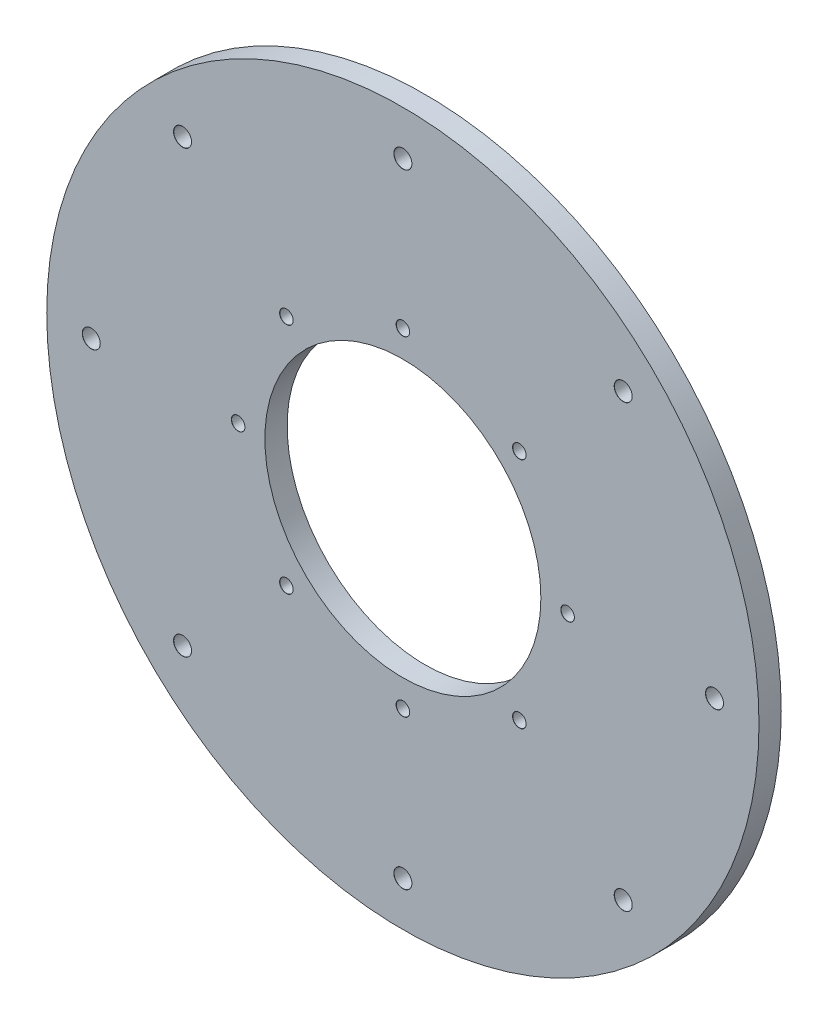
ISO-10303-21;
HEADER;
FILE_DESCRIPTION(('STEP AP214'),'2;1');
FILE_NAME('part.step','',(''),(''),'','','');
FILE_SCHEMA(('AUTOMOTIVE_DESIGN { 1 0 10303 214 1 1 1 1 }'));
ENDSEC;
DATA;
#1=APPLICATION_CONTEXT('core data for automotive mechanical design processes');
#2=APPLICATION_PROTOCOL_DEFINITION('international standard','automotive_design',2000,#1);
#3=PRODUCT_CONTEXT('',#1,'mechanical');
#4=PRODUCT('Part','Part','',(#3));
#5=PRODUCT_RELATED_PRODUCT_CATEGORY('part','',(#4));
#6=PRODUCT_DEFINITION_FORMATION('','',#4);
#7=PRODUCT_DEFINITION_CONTEXT('part definition',#1,'design');
#8=PRODUCT_DEFINITION('design','',#6,#7);
#9=PRODUCT_DEFINITION_SHAPE('','',#8);
#10=(LENGTH_UNIT() NAMED_UNIT(*) SI_UNIT(.MILLI.,.METRE.));
#11=(NAMED_UNIT(*) PLANE_ANGLE_UNIT() SI_UNIT($,.RADIAN.));
#12=(NAMED_UNIT(*) SI_UNIT($,.STERADIAN.) SOLID_ANGLE_UNIT());
#13=UNCERTAINTY_MEASURE_WITH_UNIT(LENGTH_MEASURE(1.E-05),#10,'distance_accuracy_value','');
#14=(GEOMETRIC_REPRESENTATION_CONTEXT(3) GLOBAL_UNCERTAINTY_ASSIGNED_CONTEXT((#13)) GLOBAL_UNIT_ASSIGNED_CONTEXT((#10,
#11,#12)) REPRESENTATION_CONTEXT('',''));
#15=CARTESIAN_POINT('',(0.,0.,0.));
#16=DIRECTION('',(0.,0.,1.));
#17=DIRECTION('',(1.,0.,0.));
#18=AXIS2_PLACEMENT_3D('',#15,#16,#17);
#19=CARTESIAN_POINT('',(0.,0.,0.));
#20=DIRECTION('',(0.,0.,1.));
#21=DIRECTION('',(1.,0.,0.));
#22=AXIS2_PLACEMENT_3D('',#19,#20,#21);
#23=PLANE('',#22);
#24=CARTESIAN_POINT('',(0.,37.,0.));
#25=DIRECTION('',(0.,0.,1.));
#26=DIRECTION('',(1.,0.,0.));
#27=AXIS2_PLACEMENT_3D('',#24,#25,#26);
#28=CIRCLE('',#27,1.5);
#29=CARTESIAN_POINT('',(1.5,37.,0.));
#30=VERTEX_POINT('',#29);
#31=EDGE_CURVE('E238',#30,#30,#28,.F.);
#32=ORIENTED_EDGE('',*,*,#31,.F.);
#33=EDGE_LOOP('',(#32));
#34=FACE_BOUND('',#33,.T.);
#35=CARTESIAN_POINT('',(-36.9999999999969,-3.1641356201817E-12,0.));
#36=DIRECTION('',(0.,0.,1.));
#37=DIRECTION('',(1.,0.,0.));
#38=AXIS2_PLACEMENT_3D('',#35,#36,#37);
#39=CIRCLE('',#38,1.5);
#40=CARTESIAN_POINT('',(-35.4999999999969,-3.1641356201817E-12,0.));
#41=VERTEX_POINT('',#40);
#42=EDGE_CURVE('E214',#41,#41,#39,.F.);
#43=ORIENTED_EDGE('',*,*,#42,.F.);
#44=EDGE_LOOP('',(#43));
#45=FACE_BOUND('',#44,.T.);
#46=CARTESIAN_POINT('',(-26.1629509038969,-26.1629509039045,0.));
#47=DIRECTION('',(0.,0.,1.));
#48=DIRECTION('',(1.,0.,0.));
#49=AXIS2_PLACEMENT_3D('',#46,#47,#48);
#50=CIRCLE('',#49,1.5);
#51=CARTESIAN_POINT('',(-24.6629509038969,-26.1629509039045,0.));
#52=VERTEX_POINT('',#51);
#53=EDGE_CURVE('E202',#52,#52,#50,.F.);
#54=ORIENTED_EDGE('',*,*,#53,.F.);
#55=EDGE_LOOP('',(#54));
#56=FACE_BOUND('',#55,.T.);
#57=CARTESIAN_POINT('',(6.29357677084386E-12,-37.,0.));
#58=DIRECTION('',(0.,0.,1.));
#59=DIRECTION('',(1.,0.,0.));
#60=AXIS2_PLACEMENT_3D('',#57,#58,#59);
#61=CIRCLE('',#60,1.5);
#62=CARTESIAN_POINT('',(1.50000000000629,-37.,0.));
#63=VERTEX_POINT('',#62);
#64=EDGE_CURVE('E190',#63,#63,#61,.F.);
#65=ORIENTED_EDGE('',*,*,#64,.F.);
#66=EDGE_LOOP('',(#65));
#67=FACE_BOUND('',#66,.T.);
#68=CARTESIAN_POINT('',(37.0000000000031,3.15025783237388E-12,0.));
#69=DIRECTION('',(0.,0.,1.));
#70=DIRECTION('',(1.,0.,0.));
#71=AXIS2_PLACEMENT_3D('',#68,#69,#70);
#72=CIRCLE('',#71,1.5);
#73=CARTESIAN_POINT('',(38.5000000000031,3.15025783237388E-12,0.));
#74=VERTEX_POINT('',#73);
#75=EDGE_CURVE('E166',#74,#74,#72,.F.);
#76=ORIENTED_EDGE('',*,*,#75,.F.);
#77=EDGE_LOOP('',(#76));
#78=FACE_BOUND('',#77,.T.);
#79=CARTESIAN_POINT('',(26.1629509039032,26.1629509039045,0.));
#80=DIRECTION('',(0.,0.,1.));
#81=DIRECTION('',(1.,0.,0.));
#82=AXIS2_PLACEMENT_3D('',#79,#80,#81);
#83=CIRCLE('',#82,1.5);
#84=CARTESIAN_POINT('',(27.6629509039032,26.1629509039045,0.));
#85=VERTEX_POINT('',#84);
#86=EDGE_CURVE('E154',#85,#85,#83,.F.);
#87=ORIENTED_EDGE('',*,*,#86,.F.);
#88=EDGE_LOOP('',(#87));
#89=FACE_BOUND('',#88,.T.);
#90=CARTESIAN_POINT('',(0.,70.,0.));
#91=DIRECTION('',(0.,0.,1.));
#92=DIRECTION('',(1.,0.,0.));
#93=AXIS2_PLACEMENT_3D('',#90,#91,#92);
#94=CIRCLE('',#93,1.99999999999999);
#95=CARTESIAN_POINT('',(1.99999999999999,70.,0.));
#96=VERTEX_POINT('',#95);
#97=EDGE_CURVE('E142',#96,#96,#94,.F.);
#98=ORIENTED_EDGE('',*,*,#97,.F.);
#99=EDGE_LOOP('',(#98));
#100=FACE_BOUND('',#99,.T.);
#101=CARTESIAN_POINT('',(-49.4974746830566,49.4974746830541,0.));
#102=DIRECTION('',(0.,0.,1.));
#103=DIRECTION('',(1.,0.,0.));
#104=AXIS2_PLACEMENT_3D('',#101,#102,#103);
#105=CIRCLE('',#104,1.99999999999999);
#106=CARTESIAN_POINT('',(-47.4974746830566,49.4974746830541,0.));
#107=VERTEX_POINT('',#106);
#108=EDGE_CURVE('E130',#107,#107,#105,.F.);
#109=ORIENTED_EDGE('',*,*,#108,.F.);
#110=EDGE_LOOP('',(#109));
#111=FACE_BOUND('',#110,.T.);
#112=CARTESIAN_POINT('',(-49.4974746830482,-49.4974746830625,0.));
#113=DIRECTION('',(0.,0.,1.));
#114=DIRECTION('',(1.,0.,0.));
#115=AXIS2_PLACEMENT_3D('',#112,#113,#114);
#116=CIRCLE('',#115,1.99999999999999);
#117=CARTESIAN_POINT('',(-47.4974746830482,-49.4974746830625,0.));
#118=VERTEX_POINT('',#117);
#119=EDGE_CURVE('E106',#118,#118,#116,.F.);
#120=ORIENTED_EDGE('',*,*,#119,.F.);
#121=EDGE_LOOP('',(#120));
#122=FACE_BOUND('',#121,.T.);
#123=CARTESIAN_POINT('',(1.19175502799607E-11,-70.,0.));
#124=DIRECTION('',(0.,0.,1.));
#125=DIRECTION('',(1.,0.,0.));
#126=AXIS2_PLACEMENT_3D('',#123,#124,#125);
#127=CIRCLE('',#126,1.99999999999999);
#128=CARTESIAN_POINT('',(2.00000000001191,-70.,0.));
#129=VERTEX_POINT('',#128);
#130=EDGE_CURVE('E94',#129,#129,#127,.F.);
#131=ORIENTED_EDGE('',*,*,#130,.F.);
#132=EDGE_LOOP('',(#131));
#133=FACE_BOUND('',#132,.T.);
#134=CARTESIAN_POINT('',(70.000000000006,5.9535709695524E-12,0.));
#135=DIRECTION('',(0.,0.,1.));
#136=DIRECTION('',(1.,0.,0.));
#137=AXIS2_PLACEMENT_3D('',#134,#135,#136);
#138=CIRCLE('',#137,1.99999999999999);
#139=CARTESIAN_POINT('',(72.000000000006,5.9535709695524E-12,0.));
#140=VERTEX_POINT('',#139);
#141=EDGE_CURVE('E70',#140,#140,#138,.F.);
#142=ORIENTED_EDGE('',*,*,#141,.F.);
#143=EDGE_LOOP('',(#142));
#144=FACE_BOUND('',#143,.T.);
#145=CARTESIAN_POINT('',(0.,0.,0.));
#146=DIRECTION('',(0.,0.,1.));
#147=DIRECTION('',(1.,0.,0.));
#148=AXIS2_PLACEMENT_3D('',#145,#146,#147);
#149=CIRCLE('',#148,80.);
#150=CARTESIAN_POINT('',(80.,0.,0.));
#151=VERTEX_POINT('',#150);
#152=EDGE_CURVE('E42',#151,#151,#149,.T.);
#153=ORIENTED_EDGE('',*,*,#152,.F.);
#154=EDGE_LOOP('',(#153));
#155=FACE_BOUND('',#154,.T.);
#156=CARTESIAN_POINT('',(0.,0.,0.));
#157=DIRECTION('',(0.,0.,1.));
#158=DIRECTION('',(1.,0.,0.));
#159=AXIS2_PLACEMENT_3D('',#156,#157,#158);
#160=CIRCLE('',#159,31.);
#161=CARTESIAN_POINT('',(31.,0.,0.));
#162=VERTEX_POINT('',#161);
#163=EDGE_CURVE('E54',#162,#162,#160,.T.);
#164=ORIENTED_EDGE('',*,*,#163,.T.);
#165=EDGE_LOOP('',(#164));
#166=FACE_BOUND('',#165,.T.);
#167=CARTESIAN_POINT('',(49.4974746830601,49.4974746830625,0.));
#168=DIRECTION('',(0.,0.,1.));
#169=DIRECTION('',(1.,0.,0.));
#170=AXIS2_PLACEMENT_3D('',#167,#168,#169);
#171=CIRCLE('',#170,1.99999999999999);
#172=CARTESIAN_POINT('',(51.4974746830601,49.4974746830625,0.));
#173=VERTEX_POINT('',#172);
#174=EDGE_CURVE('E58',#173,#173,#171,.F.);
#175=ORIENTED_EDGE('',*,*,#174,.F.);
#176=EDGE_LOOP('',(#175));
#177=FACE_BOUND('',#176,.T.);
#178=CARTESIAN_POINT('',(49.4974746830685,-49.4974746830541,0.));
#179=DIRECTION('',(0.,0.,1.));
#180=DIRECTION('',(1.,0.,0.));
#181=AXIS2_PLACEMENT_3D('',#178,#179,#180);
#182=CIRCLE('',#181,1.99999999999999);
#183=CARTESIAN_POINT('',(51.4974746830685,-49.4974746830541,0.));
#184=VERTEX_POINT('',#183);
#185=EDGE_CURVE('E82',#184,#184,#182,.F.);
#186=ORIENTED_EDGE('',*,*,#185,.F.);
#187=EDGE_LOOP('',(#186));
#188=FACE_BOUND('',#187,.T.);
#189=CARTESIAN_POINT('',(-69.9999999999941,-5.96744875736022E-12,0.));
#190=DIRECTION('',(0.,0.,1.));
#191=DIRECTION('',(1.,0.,0.));
#192=AXIS2_PLACEMENT_3D('',#189,#190,#191);
#193=CIRCLE('',#192,1.99999999999999);
#194=CARTESIAN_POINT('',(-67.9999999999941,-5.96744875736022E-12,0.));
#195=VERTEX_POINT('',#194);
#196=EDGE_CURVE('E118',#195,#195,#193,.F.);
#197=ORIENTED_EDGE('',*,*,#196,.F.);
#198=EDGE_LOOP('',(#197));
#199=FACE_BOUND('',#198,.T.);
#200=CARTESIAN_POINT('',(26.1629509039076,-26.1629509039,0.));
#201=DIRECTION('',(0.,0.,1.));
#202=DIRECTION('',(1.,0.,0.));
#203=AXIS2_PLACEMENT_3D('',#200,#201,#202);
#204=CIRCLE('',#203,1.5);
#205=CARTESIAN_POINT('',(27.6629509039076,-26.1629509039,0.));
#206=VERTEX_POINT('',#205);
#207=EDGE_CURVE('E178',#206,#206,#204,.F.);
#208=ORIENTED_EDGE('',*,*,#207,.F.);
#209=EDGE_LOOP('',(#208));
#210=FACE_BOUND('',#209,.T.);
#211=CARTESIAN_POINT('',(-26.1629509039013,26.1629509039,0.));
#212=DIRECTION('',(0.,0.,1.));
#213=DIRECTION('',(1.,0.,0.));
#214=AXIS2_PLACEMENT_3D('',#211,#212,#213);
#215=CIRCLE('',#214,1.5);
#216=CARTESIAN_POINT('',(-24.6629509039013,26.1629509039,0.));
#217=VERTEX_POINT('',#216);
#218=EDGE_CURVE('E226',#217,#217,#215,.F.);
#219=ORIENTED_EDGE('',*,*,#218,.F.);
#220=EDGE_LOOP('',(#219));
#221=FACE_BOUND('',#220,.T.);
#222=ADVANCED_FACE('F38',(#34,#45,#56,#67,#78,#89,#100,#111,#122,#133,#144,#155,#166,#177,#188,
#199,#210,#221),#23,.F.);
#223=CARTESIAN_POINT('',(0.,0.,5.));
#224=DIRECTION('',(0.,0.,1.));
#225=DIRECTION('',(1.,0.,0.));
#226=AXIS2_PLACEMENT_3D('',#223,#224,#225);
#227=PLANE('',#226);
#228=CARTESIAN_POINT('',(0.,37.,5.));
#229=DIRECTION('',(0.,0.,1.));
#230=DIRECTION('',(1.,0.,0.));
#231=AXIS2_PLACEMENT_3D('',#228,#229,#230);
#232=CIRCLE('',#231,1.525);
#233=CARTESIAN_POINT('',(1.525,37.,5.));
#234=VERTEX_POINT('',#233);
#235=EDGE_CURVE('E246',#234,#234,#232,.T.);
#236=ORIENTED_EDGE('',*,*,#235,.F.);
#237=EDGE_LOOP('',(#236));
#238=FACE_BOUND('',#237,.T.);
#239=CARTESIAN_POINT('',(-26.1629509039013,26.1629509039,5.));
#240=DIRECTION('',(0.,0.,1.));
#241=DIRECTION('',(1.,0.,0.));
#242=AXIS2_PLACEMENT_3D('',#239,#240,#241);
#243=CIRCLE('',#242,1.525);
#244=CARTESIAN_POINT('',(-24.6379509039013,26.1629509039,5.));
#245=VERTEX_POINT('',#244);
#246=EDGE_CURVE('E234',#245,#245,#243,.T.);
#247=ORIENTED_EDGE('',*,*,#246,.F.);
#248=EDGE_LOOP('',(#247));
#249=FACE_BOUND('',#248,.T.);
#250=CARTESIAN_POINT('',(-36.9999999999969,-3.1641356201817E-12,5.));
#251=DIRECTION('',(0.,0.,1.));
#252=DIRECTION('',(1.,0.,0.));
#253=AXIS2_PLACEMENT_3D('',#250,#251,#252);
#254=CIRCLE('',#253,1.525);
#255=CARTESIAN_POINT('',(-35.4749999999969,-3.1641356201817E-12,5.));
#256=VERTEX_POINT('',#255);
#257=EDGE_CURVE('E222',#256,#256,#254,.T.);
#258=ORIENTED_EDGE('',*,*,#257,.F.);
#259=EDGE_LOOP('',(#258));
#260=FACE_BOUND('',#259,.T.);
#261=CARTESIAN_POINT('',(-26.1629509038969,-26.1629509039045,5.));
#262=DIRECTION('',(0.,0.,1.));
#263=DIRECTION('',(1.,0.,0.));
#264=AXIS2_PLACEMENT_3D('',#261,#262,#263);
#265=CIRCLE('',#264,1.525);
#266=CARTESIAN_POINT('',(-24.6379509038969,-26.1629509039045,5.));
#267=VERTEX_POINT('',#266);
#268=EDGE_CURVE('E210',#267,#267,#265,.T.);
#269=ORIENTED_EDGE('',*,*,#268,.F.);
#270=EDGE_LOOP('',(#269));
#271=FACE_BOUND('',#270,.T.);
#272=CARTESIAN_POINT('',(6.29357677084386E-12,-37.,5.));
#273=DIRECTION('',(0.,0.,1.));
#274=DIRECTION('',(1.,0.,0.));
#275=AXIS2_PLACEMENT_3D('',#272,#273,#274);
#276=CIRCLE('',#275,1.525);
#277=CARTESIAN_POINT('',(1.52500000000629,-37.,5.));
#278=VERTEX_POINT('',#277);
#279=EDGE_CURVE('E198',#278,#278,#276,.T.);
#280=ORIENTED_EDGE('',*,*,#279,.F.);
#281=EDGE_LOOP('',(#280));
#282=FACE_BOUND('',#281,.T.);
#283=CARTESIAN_POINT('',(26.1629509039076,-26.1629509039,5.));
#284=DIRECTION('',(0.,0.,1.));
#285=DIRECTION('',(1.,0.,0.));
#286=AXIS2_PLACEMENT_3D('',#283,#284,#285);
#287=CIRCLE('',#286,1.525);
#288=CARTESIAN_POINT('',(27.6879509039076,-26.1629509039,5.));
#289=VERTEX_POINT('',#288);
#290=EDGE_CURVE('E186',#289,#289,#287,.T.);
#291=ORIENTED_EDGE('',*,*,#290,.F.);
#292=EDGE_LOOP('',(#291));
#293=FACE_BOUND('',#292,.T.);
#294=CARTESIAN_POINT('',(37.0000000000031,3.15025783237388E-12,5.));
#295=DIRECTION('',(0.,0.,1.));
#296=DIRECTION('',(1.,0.,0.));
#297=AXIS2_PLACEMENT_3D('',#294,#295,#296);
#298=CIRCLE('',#297,1.525);
#299=CARTESIAN_POINT('',(38.5250000000031,3.15025783237388E-12,5.));
#300=VERTEX_POINT('',#299);
#301=EDGE_CURVE('E174',#300,#300,#298,.T.);
#302=ORIENTED_EDGE('',*,*,#301,.F.);
#303=EDGE_LOOP('',(#302));
#304=FACE_BOUND('',#303,.T.);
#305=CARTESIAN_POINT('',(26.1629509039032,26.1629509039045,5.));
#306=DIRECTION('',(0.,0.,1.));
#307=DIRECTION('',(1.,0.,0.));
#308=AXIS2_PLACEMENT_3D('',#305,#306,#307);
#309=CIRCLE('',#308,1.525);
#310=CARTESIAN_POINT('',(27.6879509039032,26.1629509039045,5.));
#311=VERTEX_POINT('',#310);
#312=EDGE_CURVE('E162',#311,#311,#309,.T.);
#313=ORIENTED_EDGE('',*,*,#312,.F.);
#314=EDGE_LOOP('',(#313));
#315=FACE_BOUND('',#314,.T.);
#316=CARTESIAN_POINT('',(0.,70.,5.));
#317=DIRECTION('',(0.,0.,1.));
#318=DIRECTION('',(1.,0.,0.));
#319=AXIS2_PLACEMENT_3D('',#316,#317,#318);
#320=CIRCLE('',#319,2.025);
#321=CARTESIAN_POINT('',(2.025,70.,5.));
#322=VERTEX_POINT('',#321);
#323=EDGE_CURVE('E150',#322,#322,#320,.T.);
#324=ORIENTED_EDGE('',*,*,#323,.F.);
#325=EDGE_LOOP('',(#324));
#326=FACE_BOUND('',#325,.T.);
#327=CARTESIAN_POINT('',(-49.4974746830566,49.4974746830541,5.));
#328=DIRECTION('',(0.,0.,1.));
#329=DIRECTION('',(1.,0.,0.));
#330=AXIS2_PLACEMENT_3D('',#327,#328,#329);
#331=CIRCLE('',#330,2.025);
#332=CARTESIAN_POINT('',(-47.4724746830566,49.4974746830541,5.));
#333=VERTEX_POINT('',#332);
#334=EDGE_CURVE('E138',#333,#333,#331,.T.);
#335=ORIENTED_EDGE('',*,*,#334,.F.);
#336=EDGE_LOOP('',(#335));
#337=FACE_BOUND('',#336,.T.);
#338=CARTESIAN_POINT('',(-69.9999999999941,-5.96744875736022E-12,5.));
#339=DIRECTION('',(0.,0.,1.));
#340=DIRECTION('',(1.,0.,0.));
#341=AXIS2_PLACEMENT_3D('',#338,#339,#340);
#342=CIRCLE('',#341,2.025);
#343=CARTESIAN_POINT('',(-67.9749999999941,-5.96744875736022E-12,5.));
#344=VERTEX_POINT('',#343);
#345=EDGE_CURVE('E126',#344,#344,#342,.T.);
#346=ORIENTED_EDGE('',*,*,#345,.F.);
#347=EDGE_LOOP('',(#346));
#348=FACE_BOUND('',#347,.T.);
#349=CARTESIAN_POINT('',(-49.4974746830482,-49.4974746830625,5.));
#350=DIRECTION('',(0.,0.,1.));
#351=DIRECTION('',(1.,0.,0.));
#352=AXIS2_PLACEMENT_3D('',#349,#350,#351);
#353=CIRCLE('',#352,2.025);
#354=CARTESIAN_POINT('',(-47.4724746830482,-49.4974746830625,5.));
#355=VERTEX_POINT('',#354);
#356=EDGE_CURVE('E114',#355,#355,#353,.T.);
#357=ORIENTED_EDGE('',*,*,#356,.F.);
#358=EDGE_LOOP('',(#357));
#359=FACE_BOUND('',#358,.T.);
#360=CARTESIAN_POINT('',(1.19175502799607E-11,-70.,5.));
#361=DIRECTION('',(0.,0.,1.));
#362=DIRECTION('',(1.,0.,0.));
#363=AXIS2_PLACEMENT_3D('',#360,#361,#362);
#364=CIRCLE('',#363,2.025);
#365=CARTESIAN_POINT('',(2.02500000001192,-70.,5.));
#366=VERTEX_POINT('',#365);
#367=EDGE_CURVE('E102',#366,#366,#364,.T.);
#368=ORIENTED_EDGE('',*,*,#367,.F.);
#369=EDGE_LOOP('',(#368));
#370=FACE_BOUND('',#369,.T.);
#371=CARTESIAN_POINT('',(49.4974746830685,-49.4974746830541,5.));
#372=DIRECTION('',(0.,0.,1.));
#373=DIRECTION('',(1.,0.,0.));
#374=AXIS2_PLACEMENT_3D('',#371,#372,#373);
#375=CIRCLE('',#374,2.025);
#376=CARTESIAN_POINT('',(51.5224746830685,-49.4974746830541,5.));
#377=VERTEX_POINT('',#376);
#378=EDGE_CURVE('E90',#377,#377,#375,.T.);
#379=ORIENTED_EDGE('',*,*,#378,.F.);
#380=EDGE_LOOP('',(#379));
#381=FACE_BOUND('',#380,.T.);
#382=CARTESIAN_POINT('',(70.000000000006,5.9535709695524E-12,5.));
#383=DIRECTION('',(0.,0.,1.));
#384=DIRECTION('',(1.,0.,0.));
#385=AXIS2_PLACEMENT_3D('',#382,#383,#384);
#386=CIRCLE('',#385,2.025);
#387=CARTESIAN_POINT('',(72.025000000006,5.9535709695524E-12,5.));
#388=VERTEX_POINT('',#387);
#389=EDGE_CURVE('E78',#388,#388,#386,.T.);
#390=ORIENTED_EDGE('',*,*,#389,.F.);
#391=EDGE_LOOP('',(#390));
#392=FACE_BOUND('',#391,.T.);
#393=CARTESIAN_POINT('',(49.4974746830601,49.4974746830625,5.));
#394=DIRECTION('',(0.,0.,1.));
#395=DIRECTION('',(1.,0.,0.));
#396=AXIS2_PLACEMENT_3D('',#393,#394,#395);
#397=CIRCLE('',#396,2.025);
#398=CARTESIAN_POINT('',(51.5224746830601,49.4974746830625,5.));
#399=VERTEX_POINT('',#398);
#400=EDGE_CURVE('E66',#399,#399,#397,.T.);
#401=ORIENTED_EDGE('',*,*,#400,.F.);
#402=EDGE_LOOP('',(#401));
#403=FACE_BOUND('',#402,.T.);
#404=CARTESIAN_POINT('',(0.,0.,5.));
#405=DIRECTION('',(0.,0.,1.));
#406=DIRECTION('',(1.,0.,0.));
#407=AXIS2_PLACEMENT_3D('',#404,#405,#406);
#408=CIRCLE('',#407,80.);
#409=CARTESIAN_POINT('',(80.,0.,5.));
#410=VERTEX_POINT('',#409);
#411=EDGE_CURVE('E10',#410,#410,#408,.T.);
#412=ORIENTED_EDGE('',*,*,#411,.T.);
#413=EDGE_LOOP('',(#412));
#414=FACE_BOUND('',#413,.T.);
#415=CARTESIAN_POINT('',(0.,0.,5.));
#416=DIRECTION('',(0.,0.,1.));
#417=DIRECTION('',(1.,0.,0.));
#418=AXIS2_PLACEMENT_3D('',#415,#416,#417);
#419=CIRCLE('',#418,31.);
#420=CARTESIAN_POINT('',(31.,0.,5.));
#421=VERTEX_POINT('',#420);
#422=EDGE_CURVE('E52',#421,#421,#419,.T.);
#423=ORIENTED_EDGE('',*,*,#422,.F.);
#424=EDGE_LOOP('',(#423));
#425=FACE_BOUND('',#424,.T.);
#426=ADVANCED_FACE('F260',(#238,#249,#260,#271,#282,#293,#304,#315,#326,#337,#348,#359,#370,
#381,#392,#403,#414,#425),#227,.T.);
#427=CARTESIAN_POINT('',(0.,0.,5.));
#428=DIRECTION('',(0.,0.,-1.));
#429=DIRECTION('',(-1.,0.,0.));
#430=AXIS2_PLACEMENT_3D('',#427,#428,#429);
#431=CYLINDRICAL_SURFACE('',#430,80.);
#432=ORIENTED_EDGE('',*,*,#411,.F.);
#433=EDGE_LOOP('',(#432));
#434=FACE_BOUND('',#433,.T.);
#435=ORIENTED_EDGE('',*,*,#152,.T.);
#436=EDGE_LOOP('',(#435));
#437=FACE_BOUND('',#436,.T.);
#438=ADVANCED_FACE('F40',(#434,#437),#431,.T.);
#439=CARTESIAN_POINT('',(0.,0.,5.));
#440=DIRECTION('',(0.,0.,-1.));
#441=DIRECTION('',(-1.,0.,0.));
#442=AXIS2_PLACEMENT_3D('',#439,#440,#441);
#443=CYLINDRICAL_SURFACE('',#442,31.);
#444=ORIENTED_EDGE('',*,*,#422,.T.);
#445=EDGE_LOOP('',(#444));
#446=FACE_BOUND('',#445,.T.);
#447=ORIENTED_EDGE('',*,*,#163,.F.);
#448=EDGE_LOOP('',(#447));
#449=FACE_BOUND('',#448,.T.);
#450=ADVANCED_FACE('F342',(#446,#449),#443,.F.);
#451=CARTESIAN_POINT('',(49.4974746830601,49.4974746830625,5.));
#452=DIRECTION('',(0.,0.,1.));
#453=DIRECTION('',(1.,0.,0.));
#454=AXIS2_PLACEMENT_3D('',#451,#452,#453);
#455=CYLINDRICAL_SURFACE('',#454,1.99999999999999);
#456=ORIENTED_EDGE('',*,*,#174,.T.);
#457=EDGE_LOOP('',(#456));
#458=FACE_BOUND('',#457,.T.);
#459=CARTESIAN_POINT('',(49.4974746830601,49.4974746830625,4.97499999999998));
#460=DIRECTION('',(0.,0.,1.));
#461=DIRECTION('',(1.,0.,0.));
#462=AXIS2_PLACEMENT_3D('',#459,#460,#461);
#463=CIRCLE('',#462,1.99999999999999);
#464=CARTESIAN_POINT('',(51.4974746830601,49.4974746830625,4.97499999999998));
#465=VERTEX_POINT('',#464);
#466=EDGE_CURVE('E62',#465,#465,#463,.T.);
#467=ORIENTED_EDGE('',*,*,#466,.T.);
#468=EDGE_LOOP('',(#467));
#469=FACE_BOUND('',#468,.T.);
#470=ADVANCED_FACE('F345',(#458,#469),#455,.F.);
#471=CARTESIAN_POINT('',(49.4974746830601,49.4974746830625,5.));
#472=DIRECTION('',(0.,0.,1.));
#473=DIRECTION('',(1.,0.,0.));
#474=AXIS2_PLACEMENT_3D('',#471,#472,#473);
#475=CONICAL_SURFACE('',#474,2.025,0.785398163397414);
#476=ORIENTED_EDGE('',*,*,#466,.F.);
#477=EDGE_LOOP('',(#476));
#478=FACE_BOUND('',#477,.T.);
#479=ORIENTED_EDGE('',*,*,#400,.T.);
#480=EDGE_LOOP('',(#479));
#481=FACE_BOUND('',#480,.T.);
#482=ADVANCED_FACE('F351',(#478,#481),#475,.F.);
#483=CARTESIAN_POINT('',(70.000000000006,5.9535709695524E-12,5.));
#484=DIRECTION('',(0.,0.,1.));
#485=DIRECTION('',(1.,0.,0.));
#486=AXIS2_PLACEMENT_3D('',#483,#484,#485);
#487=CYLINDRICAL_SURFACE('',#486,1.99999999999999);
#488=ORIENTED_EDGE('',*,*,#141,.T.);
#489=EDGE_LOOP('',(#488));
#490=FACE_BOUND('',#489,.T.);
#491=CARTESIAN_POINT('',(70.000000000006,5.9535709695524E-12,4.97499999999998));
#492=DIRECTION('',(0.,0.,1.));
#493=DIRECTION('',(1.,0.,0.));
#494=AXIS2_PLACEMENT_3D('',#491,#492,#493);
#495=CIRCLE('',#494,1.99999999999999);
#496=CARTESIAN_POINT('',(72.000000000006,5.9535709695524E-12,4.97499999999998));
#497=VERTEX_POINT('',#496);
#498=EDGE_CURVE('E74',#497,#497,#495,.T.);
#499=ORIENTED_EDGE('',*,*,#498,.T.);
#500=EDGE_LOOP('',(#499));
#501=FACE_BOUND('',#500,.T.);
#502=ADVANCED_FACE('F358',(#490,#501),#487,.F.);
#503=CARTESIAN_POINT('',(70.000000000006,5.9535709695524E-12,5.));
#504=DIRECTION('',(0.,0.,1.));
#505=DIRECTION('',(1.,0.,0.));
#506=AXIS2_PLACEMENT_3D('',#503,#504,#505);
#507=CONICAL_SURFACE('',#506,2.025,0.785398163397414);
#508=ORIENTED_EDGE('',*,*,#498,.F.);
#509=EDGE_LOOP('',(#508));
#510=FACE_BOUND('',#509,.T.);
#511=ORIENTED_EDGE('',*,*,#389,.T.);
#512=EDGE_LOOP('',(#511));
#513=FACE_BOUND('',#512,.T.);
#514=ADVANCED_FACE('F362',(#510,#513),#507,.F.);
#515=CARTESIAN_POINT('',(49.4974746830685,-49.4974746830541,5.));
#516=DIRECTION('',(0.,0.,1.));
#517=DIRECTION('',(1.,0.,0.));
#518=AXIS2_PLACEMENT_3D('',#515,#516,#517);
#519=CYLINDRICAL_SURFACE('',#518,1.99999999999999);
#520=ORIENTED_EDGE('',*,*,#185,.T.);
#521=EDGE_LOOP('',(#520));
#522=FACE_BOUND('',#521,.T.);
#523=CARTESIAN_POINT('',(49.4974746830685,-49.4974746830541,4.97499999999998));
#524=DIRECTION('',(0.,0.,1.));
#525=DIRECTION('',(1.,0.,0.));
#526=AXIS2_PLACEMENT_3D('',#523,#524,#525);
#527=CIRCLE('',#526,1.99999999999999);
#528=CARTESIAN_POINT('',(51.4974746830685,-49.4974746830541,4.97499999999998));
#529=VERTEX_POINT('',#528);
#530=EDGE_CURVE('E86',#529,#529,#527,.T.);
#531=ORIENTED_EDGE('',*,*,#530,.T.);
#532=EDGE_LOOP('',(#531));
#533=FACE_BOUND('',#532,.T.);
#534=ADVANCED_FACE('F366',(#522,#533),#519,.F.);
#535=CARTESIAN_POINT('',(49.4974746830685,-49.4974746830541,5.));
#536=DIRECTION('',(0.,0.,1.));
#537=DIRECTION('',(1.,0.,0.));
#538=AXIS2_PLACEMENT_3D('',#535,#536,#537);
#539=CONICAL_SURFACE('',#538,2.025,0.785398163397414);
#540=ORIENTED_EDGE('',*,*,#530,.F.);
#541=EDGE_LOOP('',(#540));
#542=FACE_BOUND('',#541,.T.);
#543=ORIENTED_EDGE('',*,*,#378,.T.);
#544=EDGE_LOOP('',(#543));
#545=FACE_BOUND('',#544,.T.);
#546=ADVANCED_FACE('F370',(#542,#545),#539,.F.);
#547=CARTESIAN_POINT('',(1.19175502799607E-11,-70.,5.));
#548=DIRECTION('',(0.,0.,1.));
#549=DIRECTION('',(1.,0.,0.));
#550=AXIS2_PLACEMENT_3D('',#547,#548,#549);
#551=CYLINDRICAL_SURFACE('',#550,1.99999999999999);
#552=ORIENTED_EDGE('',*,*,#130,.T.);
#553=EDGE_LOOP('',(#552));
#554=FACE_BOUND('',#553,.T.);
#555=CARTESIAN_POINT('',(1.19175502799607E-11,-70.,4.97499999999998));
#556=DIRECTION('',(0.,0.,1.));
#557=DIRECTION('',(1.,0.,0.));
#558=AXIS2_PLACEMENT_3D('',#555,#556,#557);
#559=CIRCLE('',#558,1.99999999999999);
#560=CARTESIAN_POINT('',(2.00000000001191,-70.,4.97499999999998));
#561=VERTEX_POINT('',#560);
#562=EDGE_CURVE('E98',#561,#561,#559,.T.);
#563=ORIENTED_EDGE('',*,*,#562,.T.);
#564=EDGE_LOOP('',(#563));
#565=FACE_BOUND('',#564,.T.);
#566=ADVANCED_FACE('F374',(#554,#565),#551,.F.);
#567=CARTESIAN_POINT('',(1.19175502799607E-11,-70.,5.));
#568=DIRECTION('',(0.,0.,1.));
#569=DIRECTION('',(1.,0.,0.));
#570=AXIS2_PLACEMENT_3D('',#567,#568,#569);
#571=CONICAL_SURFACE('',#570,2.025,0.785398163397379);
#572=ORIENTED_EDGE('',*,*,#562,.F.);
#573=EDGE_LOOP('',(#572));
#574=FACE_BOUND('',#573,.T.);
#575=ORIENTED_EDGE('',*,*,#367,.T.);
#576=EDGE_LOOP('',(#575));
#577=FACE_BOUND('',#576,.T.);
#578=ADVANCED_FACE('F378',(#574,#577),#571,.F.);
#579=CARTESIAN_POINT('',(-49.4974746830482,-49.4974746830625,5.));
#580=DIRECTION('',(0.,0.,1.));
#581=DIRECTION('',(1.,0.,0.));
#582=AXIS2_PLACEMENT_3D('',#579,#580,#581);
#583=CYLINDRICAL_SURFACE('',#582,1.99999999999999);
#584=ORIENTED_EDGE('',*,*,#119,.T.);
#585=EDGE_LOOP('',(#584));
#586=FACE_BOUND('',#585,.T.);
#587=CARTESIAN_POINT('',(-49.4974746830482,-49.4974746830625,4.97499999999998));
#588=DIRECTION('',(0.,0.,1.));
#589=DIRECTION('',(1.,0.,0.));
#590=AXIS2_PLACEMENT_3D('',#587,#588,#589);
#591=CIRCLE('',#590,1.99999999999999);
#592=CARTESIAN_POINT('',(-47.4974746830482,-49.4974746830625,4.97499999999998));
#593=VERTEX_POINT('',#592);
#594=EDGE_CURVE('E110',#593,#593,#591,.T.);
#595=ORIENTED_EDGE('',*,*,#594,.T.);
#596=EDGE_LOOP('',(#595));
#597=FACE_BOUND('',#596,.T.);
#598=ADVANCED_FACE('F382',(#586,#597),#583,.F.);
#599=CARTESIAN_POINT('',(-49.4974746830482,-49.4974746830625,5.));
#600=DIRECTION('',(0.,0.,1.));
#601=DIRECTION('',(1.,0.,0.));
#602=AXIS2_PLACEMENT_3D('',#599,#600,#601);
#603=CONICAL_SURFACE('',#602,2.025,0.785398163397414);
#604=ORIENTED_EDGE('',*,*,#594,.F.);
#605=EDGE_LOOP('',(#604));
#606=FACE_BOUND('',#605,.T.);
#607=ORIENTED_EDGE('',*,*,#356,.T.);
#608=EDGE_LOOP('',(#607));
#609=FACE_BOUND('',#608,.T.);
#610=ADVANCED_FACE('F386',(#606,#609),#603,.F.);
#611=CARTESIAN_POINT('',(-69.9999999999941,-5.96744875736022E-12,5.));
#612=DIRECTION('',(0.,0.,1.));
#613=DIRECTION('',(1.,0.,0.));
#614=AXIS2_PLACEMENT_3D('',#611,#612,#613);
#615=CYLINDRICAL_SURFACE('',#614,1.99999999999999);
#616=ORIENTED_EDGE('',*,*,#196,.T.);
#617=EDGE_LOOP('',(#616));
#618=FACE_BOUND('',#617,.T.);
#619=CARTESIAN_POINT('',(-69.9999999999941,-5.96744875736022E-12,4.97499999999998));
#620=DIRECTION('',(0.,0.,1.));
#621=DIRECTION('',(1.,0.,0.));
#622=AXIS2_PLACEMENT_3D('',#619,#620,#621);
#623=CIRCLE('',#622,1.99999999999999);
#624=CARTESIAN_POINT('',(-67.9999999999941,-5.96744875736022E-12,4.97499999999998));
#625=VERTEX_POINT('',#624);
#626=EDGE_CURVE('E122',#625,#625,#623,.T.);
#627=ORIENTED_EDGE('',*,*,#626,.T.);
#628=EDGE_LOOP('',(#627));
#629=FACE_BOUND('',#628,.T.);
#630=ADVANCED_FACE('F390',(#618,#629),#615,.F.);
#631=CARTESIAN_POINT('',(-69.9999999999941,-5.96744875736022E-12,5.));
#632=DIRECTION('',(0.,0.,1.));
#633=DIRECTION('',(1.,0.,0.));
#634=AXIS2_PLACEMENT_3D('',#631,#632,#633);
#635=CONICAL_SURFACE('',#634,2.025,0.785398163397414);
#636=ORIENTED_EDGE('',*,*,#626,.F.);
#637=EDGE_LOOP('',(#636));
#638=FACE_BOUND('',#637,.T.);
#639=ORIENTED_EDGE('',*,*,#345,.T.);
#640=EDGE_LOOP('',(#639));
#641=FACE_BOUND('',#640,.T.);
#642=ADVANCED_FACE('F394',(#638,#641),#635,.F.);
#643=CARTESIAN_POINT('',(-49.4974746830566,49.4974746830541,5.));
#644=DIRECTION('',(0.,0.,1.));
#645=DIRECTION('',(1.,0.,0.));
#646=AXIS2_PLACEMENT_3D('',#643,#644,#645);
#647=CYLINDRICAL_SURFACE('',#646,1.99999999999999);
#648=ORIENTED_EDGE('',*,*,#108,.T.);
#649=EDGE_LOOP('',(#648));
#650=FACE_BOUND('',#649,.T.);
#651=CARTESIAN_POINT('',(-49.4974746830566,49.4974746830541,4.97499999999998));
#652=DIRECTION('',(0.,0.,1.));
#653=DIRECTION('',(1.,0.,0.));
#654=AXIS2_PLACEMENT_3D('',#651,#652,#653);
#655=CIRCLE('',#654,1.99999999999999);
#656=CARTESIAN_POINT('',(-47.4974746830566,49.4974746830541,4.97499999999998));
#657=VERTEX_POINT('',#656);
#658=EDGE_CURVE('E134',#657,#657,#655,.T.);
#659=ORIENTED_EDGE('',*,*,#658,.T.);
#660=EDGE_LOOP('',(#659));
#661=FACE_BOUND('',#660,.T.);
#662=ADVANCED_FACE('F398',(#650,#661),#647,.F.);
#663=CARTESIAN_POINT('',(-49.4974746830566,49.4974746830541,5.));
#664=DIRECTION('',(0.,0.,1.));
#665=DIRECTION('',(1.,0.,0.));
#666=AXIS2_PLACEMENT_3D('',#663,#664,#665);
#667=CONICAL_SURFACE('',#666,2.025,0.785398163397414);
#668=ORIENTED_EDGE('',*,*,#658,.F.);
#669=EDGE_LOOP('',(#668));
#670=FACE_BOUND('',#669,.T.);
#671=ORIENTED_EDGE('',*,*,#334,.T.);
#672=EDGE_LOOP('',(#671));
#673=FACE_BOUND('',#672,.T.);
#674=ADVANCED_FACE('F402',(#670,#673),#667,.F.);
#675=CARTESIAN_POINT('',(0.,70.,5.));
#676=DIRECTION('',(0.,0.,1.));
#677=DIRECTION('',(1.,0.,0.));
#678=AXIS2_PLACEMENT_3D('',#675,#676,#677);
#679=CYLINDRICAL_SURFACE('',#678,1.99999999999999);
#680=ORIENTED_EDGE('',*,*,#97,.T.);
#681=EDGE_LOOP('',(#680));
#682=FACE_BOUND('',#681,.T.);
#683=CARTESIAN_POINT('',(0.,70.,4.97499999999998));
#684=DIRECTION('',(0.,0.,1.));
#685=DIRECTION('',(1.,0.,0.));
#686=AXIS2_PLACEMENT_3D('',#683,#684,#685);
#687=CIRCLE('',#686,1.99999999999999);
#688=CARTESIAN_POINT('',(1.99999999999999,70.,4.97499999999998));
#689=VERTEX_POINT('',#688);
#690=EDGE_CURVE('E146',#689,#689,#687,.T.);
#691=ORIENTED_EDGE('',*,*,#690,.T.);
#692=EDGE_LOOP('',(#691));
#693=FACE_BOUND('',#692,.T.);
#694=ADVANCED_FACE('F406',(#682,#693),#679,.F.);
#695=CARTESIAN_POINT('',(0.,70.,5.));
#696=DIRECTION('',(0.,0.,1.));
#697=DIRECTION('',(1.,0.,0.));
#698=AXIS2_PLACEMENT_3D('',#695,#696,#697);
#699=CONICAL_SURFACE('',#698,2.025,0.785398163397379);
#700=ORIENTED_EDGE('',*,*,#690,.F.);
#701=EDGE_LOOP('',(#700));
#702=FACE_BOUND('',#701,.T.);
#703=ORIENTED_EDGE('',*,*,#323,.T.);
#704=EDGE_LOOP('',(#703));
#705=FACE_BOUND('',#704,.T.);
#706=ADVANCED_FACE('F410',(#702,#705),#699,.F.);
#707=CARTESIAN_POINT('',(26.1629509039032,26.1629509039045,5.));
#708=DIRECTION('',(0.,0.,1.));
#709=DIRECTION('',(1.,0.,0.));
#710=AXIS2_PLACEMENT_3D('',#707,#708,#709);
#711=CYLINDRICAL_SURFACE('',#710,1.5);
#712=ORIENTED_EDGE('',*,*,#86,.T.);
#713=EDGE_LOOP('',(#712));
#714=FACE_BOUND('',#713,.T.);
#715=CARTESIAN_POINT('',(26.1629509039032,26.1629509039045,4.97500000000001));
#716=DIRECTION('',(0.,0.,1.));
#717=DIRECTION('',(1.,0.,0.));
#718=AXIS2_PLACEMENT_3D('',#715,#716,#717);
#719=CIRCLE('',#718,1.5);
#720=CARTESIAN_POINT('',(27.6629509039032,26.1629509039045,4.97500000000001));
#721=VERTEX_POINT('',#720);
#722=EDGE_CURVE('E158',#721,#721,#719,.T.);
#723=ORIENTED_EDGE('',*,*,#722,.T.);
#724=EDGE_LOOP('',(#723));
#725=FACE_BOUND('',#724,.T.);
#726=ADVANCED_FACE('F414',(#714,#725),#711,.F.);
#727=CARTESIAN_POINT('',(26.1629509039032,26.1629509039045,5.));
#728=DIRECTION('',(0.,0.,1.));
#729=DIRECTION('',(1.,0.,0.));
#730=AXIS2_PLACEMENT_3D('',#727,#728,#729);
#731=CONICAL_SURFACE('',#730,1.525,0.785398163397483);
#732=ORIENTED_EDGE('',*,*,#722,.F.);
#733=EDGE_LOOP('',(#732));
#734=FACE_BOUND('',#733,.T.);
#735=ORIENTED_EDGE('',*,*,#312,.T.);
#736=EDGE_LOOP('',(#735));
#737=FACE_BOUND('',#736,.T.);
#738=ADVANCED_FACE('F418',(#734,#737),#731,.F.);
#739=CARTESIAN_POINT('',(37.0000000000031,3.15025783237388E-12,5.));
#740=DIRECTION('',(0.,0.,1.));
#741=DIRECTION('',(1.,0.,0.));
#742=AXIS2_PLACEMENT_3D('',#739,#740,#741);
#743=CYLINDRICAL_SURFACE('',#742,1.5);
#744=ORIENTED_EDGE('',*,*,#75,.T.);
#745=EDGE_LOOP('',(#744));
#746=FACE_BOUND('',#745,.T.);
#747=CARTESIAN_POINT('',(37.0000000000031,3.15025783237388E-12,4.97500000000001));
#748=DIRECTION('',(0.,0.,1.));
#749=DIRECTION('',(1.,0.,0.));
#750=AXIS2_PLACEMENT_3D('',#747,#748,#749);
#751=CIRCLE('',#750,1.5);
#752=CARTESIAN_POINT('',(38.5000000000031,3.15025783237388E-12,4.97500000000001));
#753=VERTEX_POINT('',#752);
#754=EDGE_CURVE('E170',#753,#753,#751,.T.);
#755=ORIENTED_EDGE('',*,*,#754,.T.);
#756=EDGE_LOOP('',(#755));
#757=FACE_BOUND('',#756,.T.);
#758=ADVANCED_FACE('F422',(#746,#757),#743,.F.);
#759=CARTESIAN_POINT('',(37.0000000000031,3.15025783237388E-12,5.));
#760=DIRECTION('',(0.,0.,1.));
#761=DIRECTION('',(1.,0.,0.));
#762=AXIS2_PLACEMENT_3D('',#759,#760,#761);
#763=CONICAL_SURFACE('',#762,1.525,0.785398163397414);
#764=ORIENTED_EDGE('',*,*,#754,.F.);
#765=EDGE_LOOP('',(#764));
#766=FACE_BOUND('',#765,.T.);
#767=ORIENTED_EDGE('',*,*,#301,.T.);
#768=EDGE_LOOP('',(#767));
#769=FACE_BOUND('',#768,.T.);
#770=ADVANCED_FACE('F426',(#766,#769),#763,.F.);
#771=CARTESIAN_POINT('',(26.1629509039076,-26.1629509039,5.));
#772=DIRECTION('',(0.,0.,1.));
#773=DIRECTION('',(1.,0.,0.));
#774=AXIS2_PLACEMENT_3D('',#771,#772,#773);
#775=CYLINDRICAL_SURFACE('',#774,1.5);
#776=ORIENTED_EDGE('',*,*,#207,.T.);
#777=EDGE_LOOP('',(#776));
#778=FACE_BOUND('',#777,.T.);
#779=CARTESIAN_POINT('',(26.1629509039076,-26.1629509039,4.97500000000001));
#780=DIRECTION('',(0.,0.,1.));
#781=DIRECTION('',(1.,0.,0.));
#782=AXIS2_PLACEMENT_3D('',#779,#780,#781);
#783=CIRCLE('',#782,1.5);
#784=CARTESIAN_POINT('',(27.6629509039076,-26.1629509039,4.97500000000001));
#785=VERTEX_POINT('',#784);
#786=EDGE_CURVE('E182',#785,#785,#783,.T.);
#787=ORIENTED_EDGE('',*,*,#786,.T.);
#788=EDGE_LOOP('',(#787));
#789=FACE_BOUND('',#788,.T.);
#790=ADVANCED_FACE('F430',(#778,#789),#775,.F.);
#791=CARTESIAN_POINT('',(26.1629509039076,-26.1629509039,5.));
#792=DIRECTION('',(0.,0.,1.));
#793=DIRECTION('',(1.,0.,0.));
#794=AXIS2_PLACEMENT_3D('',#791,#792,#793);
#795=CONICAL_SURFACE('',#794,1.525,0.785398163397483);
#796=ORIENTED_EDGE('',*,*,#786,.F.);
#797=EDGE_LOOP('',(#796));
#798=FACE_BOUND('',#797,.T.);
#799=ORIENTED_EDGE('',*,*,#290,.T.);
#800=EDGE_LOOP('',(#799));
#801=FACE_BOUND('',#800,.T.);
#802=ADVANCED_FACE('F434',(#798,#801),#795,.F.);
#803=CARTESIAN_POINT('',(6.29357677084386E-12,-37.,5.));
#804=DIRECTION('',(0.,0.,1.));
#805=DIRECTION('',(1.,0.,0.));
#806=AXIS2_PLACEMENT_3D('',#803,#804,#805);
#807=CYLINDRICAL_SURFACE('',#806,1.5);
#808=ORIENTED_EDGE('',*,*,#64,.T.);
#809=EDGE_LOOP('',(#808));
#810=FACE_BOUND('',#809,.T.);
#811=CARTESIAN_POINT('',(6.29357677084386E-12,-37.,4.97500000000001));
#812=DIRECTION('',(0.,0.,1.));
#813=DIRECTION('',(1.,0.,0.));
#814=AXIS2_PLACEMENT_3D('',#811,#812,#813);
#815=CIRCLE('',#814,1.5);
#816=CARTESIAN_POINT('',(1.50000000000629,-37.,4.97500000000001));
#817=VERTEX_POINT('',#816);
#818=EDGE_CURVE('E194',#817,#817,#815,.T.);
#819=ORIENTED_EDGE('',*,*,#818,.T.);
#820=EDGE_LOOP('',(#819));
#821=FACE_BOUND('',#820,.T.);
#822=ADVANCED_FACE('F438',(#810,#821),#807,.F.);
#823=CARTESIAN_POINT('',(6.29357677084386E-12,-37.,5.));
#824=DIRECTION('',(0.,0.,1.));
#825=DIRECTION('',(1.,0.,0.));
#826=AXIS2_PLACEMENT_3D('',#823,#824,#825);
#827=CONICAL_SURFACE('',#826,1.525,0.785398163397474);
#828=ORIENTED_EDGE('',*,*,#818,.F.);
#829=EDGE_LOOP('',(#828));
#830=FACE_BOUND('',#829,.T.);
#831=ORIENTED_EDGE('',*,*,#279,.T.);
#832=EDGE_LOOP('',(#831));
#833=FACE_BOUND('',#832,.T.);
#834=ADVANCED_FACE('F442',(#830,#833),#827,.F.);
#835=CARTESIAN_POINT('',(-26.1629509038969,-26.1629509039045,5.));
#836=DIRECTION('',(0.,0.,1.));
#837=DIRECTION('',(1.,0.,0.));
#838=AXIS2_PLACEMENT_3D('',#835,#836,#837);
#839=CYLINDRICAL_SURFACE('',#838,1.5);
#840=ORIENTED_EDGE('',*,*,#53,.T.);
#841=EDGE_LOOP('',(#840));
#842=FACE_BOUND('',#841,.T.);
#843=CARTESIAN_POINT('',(-26.1629509038969,-26.1629509039045,4.97500000000001));
#844=DIRECTION('',(0.,0.,1.));
#845=DIRECTION('',(1.,0.,0.));
#846=AXIS2_PLACEMENT_3D('',#843,#844,#845);
#847=CIRCLE('',#846,1.5);
#848=CARTESIAN_POINT('',(-24.6629509038969,-26.1629509039045,4.97500000000001));
#849=VERTEX_POINT('',#848);
#850=EDGE_CURVE('E206',#849,#849,#847,.T.);
#851=ORIENTED_EDGE('',*,*,#850,.T.);
#852=EDGE_LOOP('',(#851));
#853=FACE_BOUND('',#852,.T.);
#854=ADVANCED_FACE('F446',(#842,#853),#839,.F.);
#855=CARTESIAN_POINT('',(-26.1629509038969,-26.1629509039045,5.));
#856=DIRECTION('',(0.,0.,1.));
#857=DIRECTION('',(1.,0.,0.));
#858=AXIS2_PLACEMENT_3D('',#855,#856,#857);
#859=CONICAL_SURFACE('',#858,1.525,0.785398163397414);
#860=ORIENTED_EDGE('',*,*,#850,.F.);
#861=EDGE_LOOP('',(#860));
#862=FACE_BOUND('',#861,.T.);
#863=ORIENTED_EDGE('',*,*,#268,.T.);
#864=EDGE_LOOP('',(#863));
#865=FACE_BOUND('',#864,.T.);
#866=ADVANCED_FACE('F450',(#862,#865),#859,.F.);
#867=CARTESIAN_POINT('',(-36.9999999999969,-3.1641356201817E-12,5.));
#868=DIRECTION('',(0.,0.,1.));
#869=DIRECTION('',(1.,0.,0.));
#870=AXIS2_PLACEMENT_3D('',#867,#868,#869);
#871=CYLINDRICAL_SURFACE('',#870,1.5);
#872=ORIENTED_EDGE('',*,*,#42,.T.);
#873=EDGE_LOOP('',(#872));
#874=FACE_BOUND('',#873,.T.);
#875=CARTESIAN_POINT('',(-36.9999999999969,-3.1641356201817E-12,4.97500000000001));
#876=DIRECTION('',(0.,0.,1.));
#877=DIRECTION('',(1.,0.,0.));
#878=AXIS2_PLACEMENT_3D('',#875,#876,#877);
#879=CIRCLE('',#878,1.5);
#880=CARTESIAN_POINT('',(-35.4999999999969,-3.1641356201817E-12,4.97500000000001));
#881=VERTEX_POINT('',#880);
#882=EDGE_CURVE('E218',#881,#881,#879,.T.);
#883=ORIENTED_EDGE('',*,*,#882,.T.);
#884=EDGE_LOOP('',(#883));
#885=FACE_BOUND('',#884,.T.);
#886=ADVANCED_FACE('F454',(#874,#885),#871,.F.);
#887=CARTESIAN_POINT('',(-36.9999999999969,-3.1641356201817E-12,5.));
#888=DIRECTION('',(0.,0.,1.));
#889=DIRECTION('',(1.,0.,0.));
#890=AXIS2_PLACEMENT_3D('',#887,#888,#889);
#891=CONICAL_SURFACE('',#890,1.525,0.785398163397414);
#892=ORIENTED_EDGE('',*,*,#882,.F.);
#893=EDGE_LOOP('',(#892));
#894=FACE_BOUND('',#893,.T.);
#895=ORIENTED_EDGE('',*,*,#257,.T.);
#896=EDGE_LOOP('',(#895));
#897=FACE_BOUND('',#896,.T.);
#898=ADVANCED_FACE('F299',(#894,#897),#891,.F.);
#899=CARTESIAN_POINT('',(-26.1629509039013,26.1629509039,5.));
#900=DIRECTION('',(0.,0.,1.));
#901=DIRECTION('',(1.,0.,0.));
#902=AXIS2_PLACEMENT_3D('',#899,#900,#901);
#903=CYLINDRICAL_SURFACE('',#902,1.5);
#904=ORIENTED_EDGE('',*,*,#218,.T.);
#905=EDGE_LOOP('',(#904));
#906=FACE_BOUND('',#905,.T.);
#907=CARTESIAN_POINT('',(-26.1629509039013,26.1629509039,4.97500000000001));
#908=DIRECTION('',(0.,0.,1.));
#909=DIRECTION('',(1.,0.,0.));
#910=AXIS2_PLACEMENT_3D('',#907,#908,#909);
#911=CIRCLE('',#910,1.5);
#912=CARTESIAN_POINT('',(-24.6629509039013,26.1629509039,4.97500000000001));
#913=VERTEX_POINT('',#912);
#914=EDGE_CURVE('E230',#913,#913,#911,.T.);
#915=ORIENTED_EDGE('',*,*,#914,.T.);
#916=EDGE_LOOP('',(#915));
#917=FACE_BOUND('',#916,.T.);
#918=ADVANCED_FACE('F295',(#906,#917),#903,.F.);
#919=CARTESIAN_POINT('',(-26.1629509039013,26.1629509039,5.));
#920=DIRECTION('',(0.,0.,1.));
#921=DIRECTION('',(1.,0.,0.));
#922=AXIS2_PLACEMENT_3D('',#919,#920,#921);
#923=CONICAL_SURFACE('',#922,1.525,0.785398163397483);
#924=ORIENTED_EDGE('',*,*,#914,.F.);
#925=EDGE_LOOP('',(#924));
#926=FACE_BOUND('',#925,.T.);
#927=ORIENTED_EDGE('',*,*,#246,.T.);
#928=EDGE_LOOP('',(#927));
#929=FACE_BOUND('',#928,.T.);
#930=ADVANCED_FACE('F298',(#926,#929),#923,.F.);
#931=CARTESIAN_POINT('',(0.,37.,5.));
#932=DIRECTION('',(0.,0.,1.));
#933=DIRECTION('',(1.,0.,0.));
#934=AXIS2_PLACEMENT_3D('',#931,#932,#933);
#935=CYLINDRICAL_SURFACE('',#934,1.5);
#936=ORIENTED_EDGE('',*,*,#31,.T.);
#937=EDGE_LOOP('',(#936));
#938=FACE_BOUND('',#937,.T.);
#939=CARTESIAN_POINT('',(0.,37.,4.97500000000001));
#940=DIRECTION('',(0.,0.,1.));
#941=DIRECTION('',(1.,0.,0.));
#942=AXIS2_PLACEMENT_3D('',#939,#940,#941);
#943=CIRCLE('',#942,1.5);
#944=CARTESIAN_POINT('',(1.5,37.,4.97500000000001));
#945=VERTEX_POINT('',#944);
#946=EDGE_CURVE('E242',#945,#945,#943,.T.);
#947=ORIENTED_EDGE('',*,*,#946,.T.);
#948=EDGE_LOOP('',(#947));
#949=FACE_BOUND('',#948,.T.);
#950=ADVANCED_FACE('F255',(#938,#949),#935,.F.);
#951=CARTESIAN_POINT('',(0.,37.,5.));
#952=DIRECTION('',(0.,0.,1.));
#953=DIRECTION('',(1.,0.,0.));
#954=AXIS2_PLACEMENT_3D('',#951,#952,#953);
#955=CONICAL_SURFACE('',#954,1.525,0.785398163397474);
#956=ORIENTED_EDGE('',*,*,#946,.F.);
#957=EDGE_LOOP('',(#956));
#958=FACE_BOUND('',#957,.T.);
#959=ORIENTED_EDGE('',*,*,#235,.T.);
#960=EDGE_LOOP('',(#959));
#961=FACE_BOUND('',#960,.T.);
#962=ADVANCED_FACE('F464',(#958,#961),#955,.F.);
#963=CLOSED_SHELL('',(#222,#426,#438,#450,#470,#482,#502,#514,#534,#546,#566,#578,#598,#610,
#630,#642,#662,#674,#694,#706,#726,#738,#758,#770,#790,#802,#822,#834,#854,#866,#886,#898,#918,
#930,#950,#962));
#964=MANIFOLD_SOLID_BREP('B2',#963);
#965=ADVANCED_BREP_SHAPE_REPRESENTATION('',(#18,#964),#14);
#966=SHAPE_DEFINITION_REPRESENTATION(#9,#965);
ENDSEC;
END-ISO-10303-21;
